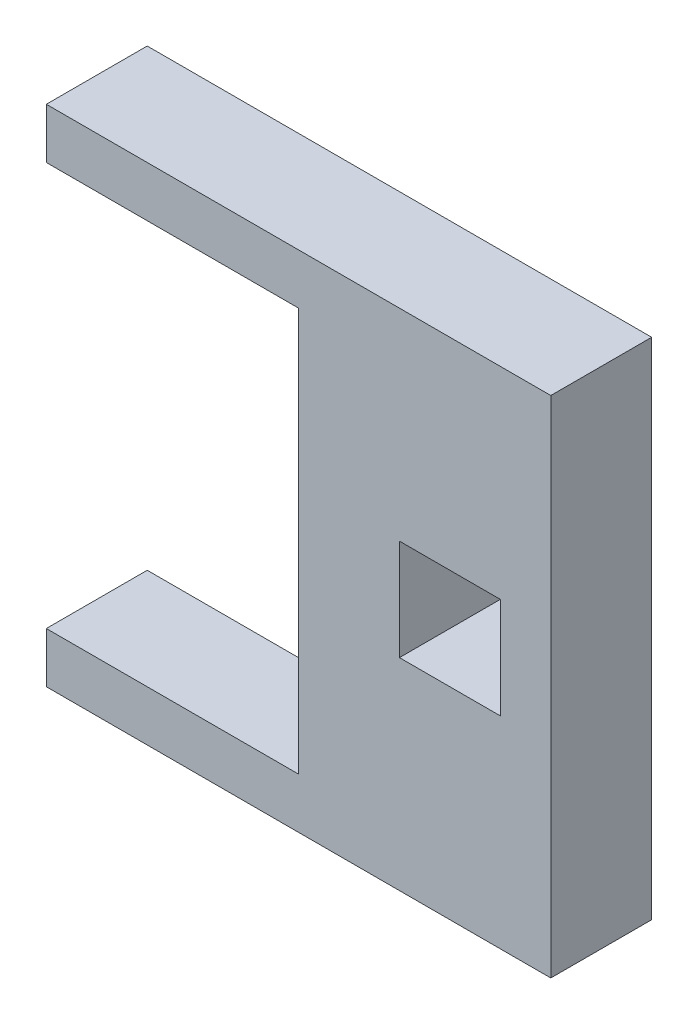
ISO-10303-21;
HEADER;
FILE_DESCRIPTION(('STEP AP214'),'2;1');
FILE_NAME('part.step','',(''),(''),'','','');
FILE_SCHEMA(('AUTOMOTIVE_DESIGN { 1 0 10303 214 1 1 1 1 }'));
ENDSEC;
DATA;
#1=APPLICATION_CONTEXT('core data for automotive mechanical design processes');
#2=APPLICATION_PROTOCOL_DEFINITION('international standard','automotive_design',2000,#1);
#3=PRODUCT_CONTEXT('',#1,'mechanical');
#4=PRODUCT('Part','Part','',(#3));
#5=PRODUCT_RELATED_PRODUCT_CATEGORY('part','',(#4));
#6=PRODUCT_DEFINITION_FORMATION('','',#4);
#7=PRODUCT_DEFINITION_CONTEXT('part definition',#1,'design');
#8=PRODUCT_DEFINITION('design','',#6,#7);
#9=PRODUCT_DEFINITION_SHAPE('','',#8);
#10=(LENGTH_UNIT() NAMED_UNIT(*) SI_UNIT(.MILLI.,.METRE.));
#11=(NAMED_UNIT(*) PLANE_ANGLE_UNIT() SI_UNIT($,.RADIAN.));
#12=(NAMED_UNIT(*) SI_UNIT($,.STERADIAN.) SOLID_ANGLE_UNIT());
#13=UNCERTAINTY_MEASURE_WITH_UNIT(LENGTH_MEASURE(1.E-05),#10,'distance_accuracy_value','');
#14=(GEOMETRIC_REPRESENTATION_CONTEXT(3) GLOBAL_UNCERTAINTY_ASSIGNED_CONTEXT((#13)) GLOBAL_UNIT_ASSIGNED_CONTEXT((#10,
#11,#12)) REPRESENTATION_CONTEXT('',''));
#15=CARTESIAN_POINT('',(0.,0.,0.));
#16=DIRECTION('',(0.,0.,1.));
#17=DIRECTION('',(1.,0.,0.));
#18=AXIS2_PLACEMENT_3D('',#15,#16,#17);
#19=CARTESIAN_POINT('',(0.,0.,10.));
#20=DIRECTION('',(0.,0.,1.));
#21=DIRECTION('',(1.,0.,0.));
#22=AXIS2_PLACEMENT_3D('',#19,#20,#21);
#23=PLANE('',#22);
#24=DIRECTION('',(0.,-1.,0.));
#25=VECTOR('',#24,1.);
#26=CARTESIAN_POINT('',(0.,0.,10.));
#27=LINE('',#26,#25);
#28=CARTESIAN_POINT('',(0.,5.,10.));
#29=VERTEX_POINT('',#28);
#30=CARTESIAN_POINT('',(0.,0.,10.));
#31=VERTEX_POINT('',#30);
#32=EDGE_CURVE('E158',#29,#31,#27,.T.);
#33=ORIENTED_EDGE('',*,*,#32,.T.);
#34=DIRECTION('',(1.,0.,0.));
#35=VECTOR('',#34,1.);
#36=CARTESIAN_POINT('',(0.,0.,10.));
#37=LINE('',#36,#35);
#38=CARTESIAN_POINT('',(50.,0.,10.));
#39=VERTEX_POINT('',#38);
#40=EDGE_CURVE('E161',#31,#39,#37,.T.);
#41=ORIENTED_EDGE('',*,*,#40,.T.);
#42=DIRECTION('',(0.,1.,0.));
#43=VECTOR('',#42,1.);
#44=CARTESIAN_POINT('',(50.,0.,10.));
#45=LINE('',#44,#43);
#46=CARTESIAN_POINT('',(50.,50.,10.));
#47=VERTEX_POINT('',#46);
#48=EDGE_CURVE('E164',#39,#47,#45,.T.);
#49=ORIENTED_EDGE('',*,*,#48,.T.);
#50=DIRECTION('',(-1.,0.,0.));
#51=VECTOR('',#50,1.);
#52=CARTESIAN_POINT('',(0.,50.,10.));
#53=LINE('',#52,#51);
#54=CARTESIAN_POINT('',(0.,50.,10.));
#55=VERTEX_POINT('',#54);
#56=EDGE_CURVE('E166',#47,#55,#53,.T.);
#57=ORIENTED_EDGE('',*,*,#56,.T.);
#58=DIRECTION('',(0.,-1.,0.));
#59=VECTOR('',#58,1.);
#60=CARTESIAN_POINT('',(0.,45.,10.));
#61=LINE('',#60,#59);
#62=CARTESIAN_POINT('',(0.,45.,10.));
#63=VERTEX_POINT('',#62);
#64=EDGE_CURVE('E168',#55,#63,#61,.T.);
#65=ORIENTED_EDGE('',*,*,#64,.T.);
#66=DIRECTION('',(1.,0.,0.));
#67=VECTOR('',#66,1.);
#68=CARTESIAN_POINT('',(0.,45.,10.));
#69=LINE('',#68,#67);
#70=CARTESIAN_POINT('',(25.,45.,10.));
#71=VERTEX_POINT('',#70);
#72=EDGE_CURVE('E170',#63,#71,#69,.T.);
#73=ORIENTED_EDGE('',*,*,#72,.T.);
#74=DIRECTION('',(0.,-1.,0.));
#75=VECTOR('',#74,1.);
#76=CARTESIAN_POINT('',(25.,45.,10.));
#77=LINE('',#76,#75);
#78=CARTESIAN_POINT('',(25.,5.,10.));
#79=VERTEX_POINT('',#78);
#80=EDGE_CURVE('E172',#71,#79,#77,.T.);
#81=ORIENTED_EDGE('',*,*,#80,.T.);
#82=DIRECTION('',(-1.,0.,0.));
#83=VECTOR('',#82,1.);
#84=CARTESIAN_POINT('',(25.,5.,10.));
#85=LINE('',#84,#83);
#86=EDGE_CURVE('E174',#79,#29,#85,.T.);
#87=ORIENTED_EDGE('',*,*,#86,.T.);
#88=EDGE_LOOP('',(#33,#41,#49,#57,#65,#73,#81,#87));
#89=FACE_BOUND('',#88,.T.);
#90=DIRECTION('',(-1.,0.,0.));
#91=VECTOR('',#90,1.);
#92=CARTESIAN_POINT('',(45.,30.,10.));
#93=LINE('',#92,#91);
#94=CARTESIAN_POINT('',(45.,30.,10.));
#95=VERTEX_POINT('',#94);
#96=CARTESIAN_POINT('',(35.,30.,10.));
#97=VERTEX_POINT('',#96);
#98=EDGE_CURVE('E130',#95,#97,#93,.T.);
#99=ORIENTED_EDGE('',*,*,#98,.F.);
#100=DIRECTION('',(0.,1.,0.));
#101=VECTOR('',#100,1.);
#102=CARTESIAN_POINT('',(45.,30.,10.));
#103=LINE('',#102,#101);
#104=CARTESIAN_POINT('',(45.,20.,10.));
#105=VERTEX_POINT('',#104);
#106=EDGE_CURVE('E122',#105,#95,#103,.T.);
#107=ORIENTED_EDGE('',*,*,#106,.F.);
#108=DIRECTION('',(1.,0.,0.));
#109=VECTOR('',#108,1.);
#110=CARTESIAN_POINT('',(45.,20.,10.));
#111=LINE('',#110,#109);
#112=CARTESIAN_POINT('',(35.,20.,10.));
#113=VERTEX_POINT('',#112);
#114=EDGE_CURVE('E144',#113,#105,#111,.T.);
#115=ORIENTED_EDGE('',*,*,#114,.F.);
#116=DIRECTION('',(0.,-1.,0.));
#117=VECTOR('',#116,1.);
#118=CARTESIAN_POINT('',(35.,30.,10.));
#119=LINE('',#118,#117);
#120=EDGE_CURVE('E142',#97,#113,#119,.T.);
#121=ORIENTED_EDGE('',*,*,#120,.F.);
#122=EDGE_LOOP('',(#99,#107,#115,#121));
#123=FACE_BOUND('',#122,.T.);
#124=ADVANCED_FACE('F33',(#89,#123),#23,.T.);
#125=CARTESIAN_POINT('',(0.,0.,0.));
#126=DIRECTION('',(0.,0.,1.));
#127=DIRECTION('',(1.,0.,0.));
#128=AXIS2_PLACEMENT_3D('',#125,#126,#127);
#129=PLANE('',#128);
#130=DIRECTION('',(0.,-1.,0.));
#131=VECTOR('',#130,1.);
#132=CARTESIAN_POINT('',(0.,0.,0.));
#133=LINE('',#132,#131);
#134=CARTESIAN_POINT('',(0.,5.,0.));
#135=VERTEX_POINT('',#134);
#136=CARTESIAN_POINT('',(0.,0.,0.));
#137=VERTEX_POINT('',#136);
#138=EDGE_CURVE('E138',#135,#137,#133,.T.);
#139=ORIENTED_EDGE('',*,*,#138,.F.);
#140=DIRECTION('',(-1.,0.,0.));
#141=VECTOR('',#140,1.);
#142=CARTESIAN_POINT('',(25.,5.,0.));
#143=LINE('',#142,#141);
#144=CARTESIAN_POINT('',(25.,5.,0.));
#145=VERTEX_POINT('',#144);
#146=EDGE_CURVE('E162',#145,#135,#143,.T.);
#147=ORIENTED_EDGE('',*,*,#146,.F.);
#148=DIRECTION('',(0.,-1.,0.));
#149=VECTOR('',#148,1.);
#150=CARTESIAN_POINT('',(25.,45.,0.));
#151=LINE('',#150,#149);
#152=CARTESIAN_POINT('',(25.,45.,0.));
#153=VERTEX_POINT('',#152);
#154=EDGE_CURVE('E189',#153,#145,#151,.T.);
#155=ORIENTED_EDGE('',*,*,#154,.F.);
#156=DIRECTION('',(1.,0.,0.));
#157=VECTOR('',#156,1.);
#158=CARTESIAN_POINT('',(0.,45.,0.));
#159=LINE('',#158,#157);
#160=CARTESIAN_POINT('',(0.,45.,0.));
#161=VERTEX_POINT('',#160);
#162=EDGE_CURVE('E187',#161,#153,#159,.T.);
#163=ORIENTED_EDGE('',*,*,#162,.F.);
#164=DIRECTION('',(0.,-1.,0.));
#165=VECTOR('',#164,1.);
#166=CARTESIAN_POINT('',(0.,45.,0.));
#167=LINE('',#166,#165);
#168=CARTESIAN_POINT('',(0.,50.,0.));
#169=VERTEX_POINT('',#168);
#170=EDGE_CURVE('E185',#169,#161,#167,.T.);
#171=ORIENTED_EDGE('',*,*,#170,.F.);
#172=DIRECTION('',(-1.,0.,0.));
#173=VECTOR('',#172,1.);
#174=CARTESIAN_POINT('',(0.,50.,0.));
#175=LINE('',#174,#173);
#176=CARTESIAN_POINT('',(50.,50.,0.));
#177=VERTEX_POINT('',#176);
#178=EDGE_CURVE('E183',#177,#169,#175,.T.);
#179=ORIENTED_EDGE('',*,*,#178,.F.);
#180=DIRECTION('',(0.,1.,0.));
#181=VECTOR('',#180,1.);
#182=CARTESIAN_POINT('',(50.,0.,0.));
#183=LINE('',#182,#181);
#184=CARTESIAN_POINT('',(50.,0.,0.));
#185=VERTEX_POINT('',#184);
#186=EDGE_CURVE('E181',#185,#177,#183,.T.);
#187=ORIENTED_EDGE('',*,*,#186,.F.);
#188=DIRECTION('',(1.,0.,0.));
#189=VECTOR('',#188,1.);
#190=CARTESIAN_POINT('',(0.,0.,0.));
#191=LINE('',#190,#189);
#192=EDGE_CURVE('E179',#137,#185,#191,.T.);
#193=ORIENTED_EDGE('',*,*,#192,.F.);
#194=EDGE_LOOP('',(#139,#147,#155,#163,#171,#179,#187,#193));
#195=FACE_BOUND('',#194,.T.);
#196=DIRECTION('',(0.,1.,0.));
#197=VECTOR('',#196,1.);
#198=CARTESIAN_POINT('',(45.,30.,0.));
#199=LINE('',#198,#197);
#200=CARTESIAN_POINT('',(45.,20.,0.));
#201=VERTEX_POINT('',#200);
#202=CARTESIAN_POINT('',(45.,30.,0.));
#203=VERTEX_POINT('',#202);
#204=EDGE_CURVE('E56',#201,#203,#199,.T.);
#205=ORIENTED_EDGE('',*,*,#204,.T.);
#206=DIRECTION('',(-1.,0.,0.));
#207=VECTOR('',#206,1.);
#208=CARTESIAN_POINT('',(45.,30.,0.));
#209=LINE('',#208,#207);
#210=CARTESIAN_POINT('',(35.,30.,0.));
#211=VERTEX_POINT('',#210);
#212=EDGE_CURVE('E137',#203,#211,#209,.T.);
#213=ORIENTED_EDGE('',*,*,#212,.T.);
#214=DIRECTION('',(0.,-1.,0.));
#215=VECTOR('',#214,1.);
#216=CARTESIAN_POINT('',(35.,30.,0.));
#217=LINE('',#216,#215);
#218=CARTESIAN_POINT('',(35.,20.,0.));
#219=VERTEX_POINT('',#218);
#220=EDGE_CURVE('E150',#211,#219,#217,.T.);
#221=ORIENTED_EDGE('',*,*,#220,.T.);
#222=DIRECTION('',(1.,0.,0.));
#223=VECTOR('',#222,1.);
#224=CARTESIAN_POINT('',(45.,20.,0.));
#225=LINE('',#224,#223);
#226=EDGE_CURVE('E131',#219,#201,#225,.T.);
#227=ORIENTED_EDGE('',*,*,#226,.T.);
#228=EDGE_LOOP('',(#205,#213,#221,#227));
#229=FACE_BOUND('',#228,.T.);
#230=ADVANCED_FACE('F219',(#195,#229),#129,.F.);
#231=CARTESIAN_POINT('',(0.,0.,10.));
#232=DIRECTION('',(1.,0.,0.));
#233=DIRECTION('',(0.,0.,-1.));
#234=AXIS2_PLACEMENT_3D('',#231,#232,#233);
#235=PLANE('',#234);
#236=ORIENTED_EDGE('',*,*,#138,.T.);
#237=DIRECTION('',(0.,0.,-1.));
#238=VECTOR('',#237,1.);
#239=CARTESIAN_POINT('',(0.,0.,10.));
#240=LINE('',#239,#238);
#241=EDGE_CURVE('E11',#31,#137,#240,.T.);
#242=ORIENTED_EDGE('',*,*,#241,.F.);
#243=ORIENTED_EDGE('',*,*,#32,.F.);
#244=DIRECTION('',(0.,0.,-1.));
#245=VECTOR('',#244,1.);
#246=CARTESIAN_POINT('',(0.,5.,10.));
#247=LINE('',#246,#245);
#248=EDGE_CURVE('E176',#29,#135,#247,.T.);
#249=ORIENTED_EDGE('',*,*,#248,.T.);
#250=EDGE_LOOP('',(#236,#242,#243,#249));
#251=FACE_BOUND('',#250,.T.);
#252=ADVANCED_FACE('F35',(#251),#235,.F.);
#253=CARTESIAN_POINT('',(0.,0.,10.));
#254=DIRECTION('',(0.,1.,0.));
#255=DIRECTION('',(0.,0.,1.));
#256=AXIS2_PLACEMENT_3D('',#253,#254,#255);
#257=PLANE('',#256);
#258=ORIENTED_EDGE('',*,*,#192,.T.);
#259=DIRECTION('',(0.,0.,-1.));
#260=VECTOR('',#259,1.);
#261=CARTESIAN_POINT('',(50.,0.,10.));
#262=LINE('',#261,#260);
#263=EDGE_CURVE('E41',#39,#185,#262,.T.);
#264=ORIENTED_EDGE('',*,*,#263,.F.);
#265=ORIENTED_EDGE('',*,*,#40,.F.);
#266=ORIENTED_EDGE('',*,*,#241,.T.);
#267=EDGE_LOOP('',(#258,#264,#265,#266));
#268=FACE_BOUND('',#267,.T.);
#269=ADVANCED_FACE('F236',(#268),#257,.F.);
#270=CARTESIAN_POINT('',(50.,0.,10.));
#271=DIRECTION('',(-1.,0.,0.));
#272=DIRECTION('',(0.,0.,1.));
#273=AXIS2_PLACEMENT_3D('',#270,#271,#272);
#274=PLANE('',#273);
#275=ORIENTED_EDGE('',*,*,#186,.T.);
#276=DIRECTION('',(0.,0.,-1.));
#277=VECTOR('',#276,1.);
#278=CARTESIAN_POINT('',(50.,50.,10.));
#279=LINE('',#278,#277);
#280=EDGE_CURVE('E206',#47,#177,#279,.T.);
#281=ORIENTED_EDGE('',*,*,#280,.F.);
#282=ORIENTED_EDGE('',*,*,#48,.F.);
#283=ORIENTED_EDGE('',*,*,#263,.T.);
#284=EDGE_LOOP('',(#275,#281,#282,#283));
#285=FACE_BOUND('',#284,.T.);
#286=ADVANCED_FACE('F213',(#285),#274,.F.);
#287=CARTESIAN_POINT('',(0.,50.,10.));
#288=DIRECTION('',(0.,-1.,0.));
#289=DIRECTION('',(0.,0.,-1.));
#290=AXIS2_PLACEMENT_3D('',#287,#288,#289);
#291=PLANE('',#290);
#292=ORIENTED_EDGE('',*,*,#178,.T.);
#293=DIRECTION('',(0.,0.,-1.));
#294=VECTOR('',#293,1.);
#295=CARTESIAN_POINT('',(0.,50.,10.));
#296=LINE('',#295,#294);
#297=EDGE_CURVE('E203',#55,#169,#296,.T.);
#298=ORIENTED_EDGE('',*,*,#297,.F.);
#299=ORIENTED_EDGE('',*,*,#56,.F.);
#300=ORIENTED_EDGE('',*,*,#280,.T.);
#301=EDGE_LOOP('',(#292,#298,#299,#300));
#302=FACE_BOUND('',#301,.T.);
#303=ADVANCED_FACE('F225',(#302),#291,.F.);
#304=CARTESIAN_POINT('',(0.,45.,10.));
#305=DIRECTION('',(1.,0.,0.));
#306=DIRECTION('',(0.,0.,-1.));
#307=AXIS2_PLACEMENT_3D('',#304,#305,#306);
#308=PLANE('',#307);
#309=ORIENTED_EDGE('',*,*,#170,.T.);
#310=DIRECTION('',(0.,0.,-1.));
#311=VECTOR('',#310,1.);
#312=CARTESIAN_POINT('',(0.,45.,10.));
#313=LINE('',#312,#311);
#314=EDGE_CURVE('E200',#63,#161,#313,.T.);
#315=ORIENTED_EDGE('',*,*,#314,.F.);
#316=ORIENTED_EDGE('',*,*,#64,.F.);
#317=ORIENTED_EDGE('',*,*,#297,.T.);
#318=EDGE_LOOP('',(#309,#315,#316,#317));
#319=FACE_BOUND('',#318,.T.);
#320=ADVANCED_FACE('F229',(#319),#308,.F.);
#321=CARTESIAN_POINT('',(0.,45.,10.));
#322=DIRECTION('',(0.,1.,0.));
#323=DIRECTION('',(-1.,0.,0.));
#324=AXIS2_PLACEMENT_3D('',#321,#322,#323);
#325=PLANE('',#324);
#326=ORIENTED_EDGE('',*,*,#162,.T.);
#327=DIRECTION('',(0.,0.,-1.));
#328=VECTOR('',#327,1.);
#329=CARTESIAN_POINT('',(25.,45.,10.));
#330=LINE('',#329,#328);
#331=EDGE_CURVE('E197',#71,#153,#330,.T.);
#332=ORIENTED_EDGE('',*,*,#331,.F.);
#333=ORIENTED_EDGE('',*,*,#72,.F.);
#334=ORIENTED_EDGE('',*,*,#314,.T.);
#335=EDGE_LOOP('',(#326,#332,#333,#334));
#336=FACE_BOUND('',#335,.T.);
#337=ADVANCED_FACE('F249',(#336),#325,.F.);
#338=CARTESIAN_POINT('',(25.,45.,10.));
#339=DIRECTION('',(1.,0.,0.));
#340=DIRECTION('',(0.,1.,0.));
#341=AXIS2_PLACEMENT_3D('',#338,#339,#340);
#342=PLANE('',#341);
#343=ORIENTED_EDGE('',*,*,#154,.T.);
#344=DIRECTION('',(0.,0.,-1.));
#345=VECTOR('',#344,1.);
#346=CARTESIAN_POINT('',(25.,5.,10.));
#347=LINE('',#346,#345);
#348=EDGE_CURVE('E194',#79,#145,#347,.T.);
#349=ORIENTED_EDGE('',*,*,#348,.F.);
#350=ORIENTED_EDGE('',*,*,#80,.F.);
#351=ORIENTED_EDGE('',*,*,#331,.T.);
#352=EDGE_LOOP('',(#343,#349,#350,#351));
#353=FACE_BOUND('',#352,.T.);
#354=ADVANCED_FACE('F247',(#353),#342,.F.);
#355=CARTESIAN_POINT('',(25.,5.,10.));
#356=DIRECTION('',(0.,-1.,0.));
#357=DIRECTION('',(1.,0.,0.));
#358=AXIS2_PLACEMENT_3D('',#355,#356,#357);
#359=PLANE('',#358);
#360=ORIENTED_EDGE('',*,*,#146,.T.);
#361=ORIENTED_EDGE('',*,*,#248,.F.);
#362=ORIENTED_EDGE('',*,*,#86,.F.);
#363=ORIENTED_EDGE('',*,*,#348,.T.);
#364=EDGE_LOOP('',(#360,#361,#362,#363));
#365=FACE_BOUND('',#364,.T.);
#366=ADVANCED_FACE('F242',(#365),#359,.F.);
#367=CARTESIAN_POINT('',(45.,30.,10.));
#368=DIRECTION('',(-1.,0.,0.));
#369=DIRECTION('',(0.,0.,1.));
#370=AXIS2_PLACEMENT_3D('',#367,#368,#369);
#371=PLANE('',#370);
#372=ORIENTED_EDGE('',*,*,#204,.F.);
#373=DIRECTION('',(0.,0.,-1.));
#374=VECTOR('',#373,1.);
#375=CARTESIAN_POINT('',(45.,20.,10.));
#376=LINE('',#375,#374);
#377=EDGE_CURVE('E126',#105,#201,#376,.T.);
#378=ORIENTED_EDGE('',*,*,#377,.F.);
#379=ORIENTED_EDGE('',*,*,#106,.T.);
#380=DIRECTION('',(0.,0.,-1.));
#381=VECTOR('',#380,1.);
#382=CARTESIAN_POINT('',(45.,30.,10.));
#383=LINE('',#382,#381);
#384=EDGE_CURVE('E125',#95,#203,#383,.T.);
#385=ORIENTED_EDGE('',*,*,#384,.T.);
#386=EDGE_LOOP('',(#372,#378,#379,#385));
#387=FACE_BOUND('',#386,.T.);
#388=ADVANCED_FACE('F124',(#387),#371,.T.);
#389=CARTESIAN_POINT('',(45.,30.,10.));
#390=DIRECTION('',(0.,-1.,0.));
#391=DIRECTION('',(0.,0.,-1.));
#392=AXIS2_PLACEMENT_3D('',#389,#390,#391);
#393=PLANE('',#392);
#394=ORIENTED_EDGE('',*,*,#212,.F.);
#395=ORIENTED_EDGE('',*,*,#384,.F.);
#396=ORIENTED_EDGE('',*,*,#98,.T.);
#397=DIRECTION('',(0.,0.,-1.));
#398=VECTOR('',#397,1.);
#399=CARTESIAN_POINT('',(35.,30.,10.));
#400=LINE('',#399,#398);
#401=EDGE_CURVE('E139',#97,#211,#400,.T.);
#402=ORIENTED_EDGE('',*,*,#401,.T.);
#403=EDGE_LOOP('',(#394,#395,#396,#402));
#404=FACE_BOUND('',#403,.T.);
#405=ADVANCED_FACE('F134',(#404),#393,.T.);
#406=CARTESIAN_POINT('',(35.,30.,10.));
#407=DIRECTION('',(1.,0.,0.));
#408=DIRECTION('',(0.,0.,-1.));
#409=AXIS2_PLACEMENT_3D('',#406,#407,#408);
#410=PLANE('',#409);
#411=ORIENTED_EDGE('',*,*,#220,.F.);
#412=ORIENTED_EDGE('',*,*,#401,.F.);
#413=ORIENTED_EDGE('',*,*,#120,.T.);
#414=DIRECTION('',(0.,0.,-1.));
#415=VECTOR('',#414,1.);
#416=CARTESIAN_POINT('',(35.,20.,10.));
#417=LINE('',#416,#415);
#418=EDGE_CURVE('E48',#113,#219,#417,.T.);
#419=ORIENTED_EDGE('',*,*,#418,.T.);
#420=EDGE_LOOP('',(#411,#412,#413,#419));
#421=FACE_BOUND('',#420,.T.);
#422=ADVANCED_FACE('F274',(#421),#410,.T.);
#423=CARTESIAN_POINT('',(45.,20.,10.));
#424=DIRECTION('',(0.,1.,0.));
#425=DIRECTION('',(0.,0.,1.));
#426=AXIS2_PLACEMENT_3D('',#423,#424,#425);
#427=PLANE('',#426);
#428=ORIENTED_EDGE('',*,*,#226,.F.);
#429=ORIENTED_EDGE('',*,*,#418,.F.);
#430=ORIENTED_EDGE('',*,*,#114,.T.);
#431=ORIENTED_EDGE('',*,*,#377,.T.);
#432=EDGE_LOOP('',(#428,#429,#430,#431));
#433=FACE_BOUND('',#432,.T.);
#434=ADVANCED_FACE('F278',(#433),#427,.T.);
#435=CLOSED_SHELL('',(#124,#230,#252,#269,#286,#303,#320,#337,#354,#366,#388,#405,#422,#434));
#436=MANIFOLD_SOLID_BREP('B2',#435);
#437=ADVANCED_BREP_SHAPE_REPRESENTATION('',(#18,#436),#14);
#438=SHAPE_DEFINITION_REPRESENTATION(#9,#437);
ENDSEC;
END-ISO-10303-21;
